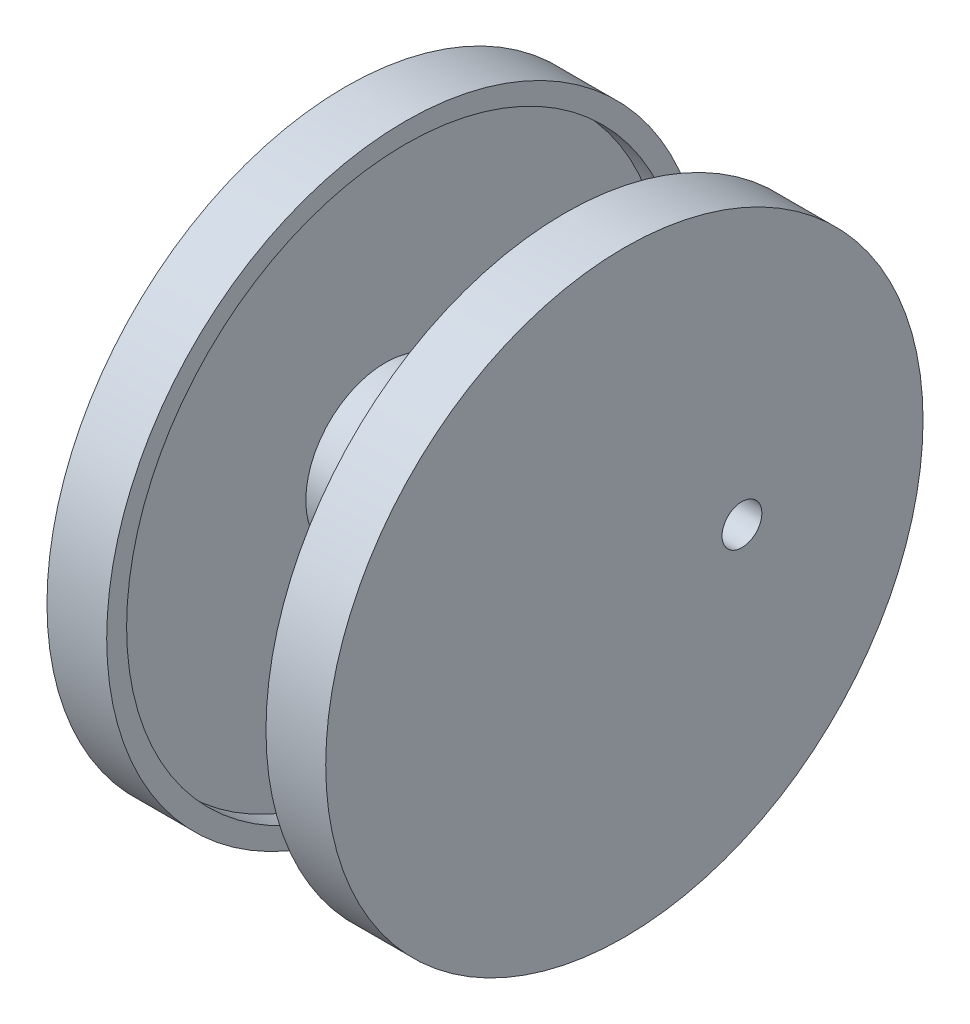
ISO-10303-21;
HEADER;
FILE_DESCRIPTION(('STEP AP214'),'2;1');
FILE_NAME('part.step','',(''),(''),'','','');
FILE_SCHEMA(('AUTOMOTIVE_DESIGN { 1 0 10303 214 1 1 1 1 }'));
ENDSEC;
DATA;
#1=APPLICATION_CONTEXT('core data for automotive mechanical design processes');
#2=APPLICATION_PROTOCOL_DEFINITION('international standard','automotive_design',2000,#1);
#3=PRODUCT_CONTEXT('',#1,'mechanical');
#4=PRODUCT('Part','Part','',(#3));
#5=PRODUCT_RELATED_PRODUCT_CATEGORY('part','',(#4));
#6=PRODUCT_DEFINITION_FORMATION('','',#4);
#7=PRODUCT_DEFINITION_CONTEXT('part definition',#1,'design');
#8=PRODUCT_DEFINITION('design','',#6,#7);
#9=PRODUCT_DEFINITION_SHAPE('','',#8);
#10=(LENGTH_UNIT() NAMED_UNIT(*) SI_UNIT(.MILLI.,.METRE.));
#11=(NAMED_UNIT(*) PLANE_ANGLE_UNIT() SI_UNIT($,.RADIAN.));
#12=(NAMED_UNIT(*) SI_UNIT($,.STERADIAN.) SOLID_ANGLE_UNIT());
#13=UNCERTAINTY_MEASURE_WITH_UNIT(LENGTH_MEASURE(1.E-05),#10,'distance_accuracy_value','');
#14=(GEOMETRIC_REPRESENTATION_CONTEXT(3) GLOBAL_UNCERTAINTY_ASSIGNED_CONTEXT((#13)) GLOBAL_UNIT_ASSIGNED_CONTEXT((#10,
#11,#12)) REPRESENTATION_CONTEXT('',''));
#15=CARTESIAN_POINT('',(0.,0.,0.));
#16=DIRECTION('',(0.,0.,1.));
#17=DIRECTION('',(1.,0.,0.));
#18=AXIS2_PLACEMENT_3D('',#15,#16,#17);
#19=CARTESIAN_POINT('',(-52.1153846153846,0.,0.));
#20=DIRECTION('',(1.,0.,0.));
#21=DIRECTION('',(0.,0.,-1.));
#22=AXIS2_PLACEMENT_3D('',#19,#20,#21);
#23=PLANE('',#22);
#24=DIRECTION('',(0.,-0.518631798459007,-0.854997694515708));
#25=VECTOR('',#24,1.);
#26=CARTESIAN_POINT('',(-52.1153846153846,40.0747288386996,62.2094535300279));
#27=LINE('',#26,#25);
#28=CARTESIAN_POINT('',(-52.1153846153846,40.0747288386996,62.2094535300279));
#29=VERTEX_POINT('',#28);
#30=CARTESIAN_POINT('',(-52.1153846153846,36.9617005075422,57.0774271984184));
#31=VERTEX_POINT('',#30);
#32=EDGE_CURVE('E212',#29,#31,#27,.T.);
#33=ORIENTED_EDGE('',*,*,#32,.F.);
#34=CARTESIAN_POINT('',(-52.1153846153846,0.,0.));
#35=DIRECTION('',(-1.,0.,0.));
#36=DIRECTION('',(0.,-0.95105651629515,0.309016994374958));
#37=AXIS2_PLACEMENT_3D('',#34,#35,#36);
#38=CIRCLE('',#37,74.);
#39=CARTESIAN_POINT('',(-52.1153846153846,4.14466266265028,73.8838397175785));
#40=VERTEX_POINT('',#39);
#41=EDGE_CURVE('E58',#40,#29,#38,.T.);
#42=ORIENTED_EDGE('',*,*,#41,.F.);
#43=DIRECTION('',(0.,0.0829730968038421,0.996551787518732));
#44=VECTOR('',#43,1.);
#45=CARTESIAN_POINT('',(-52.1153846153846,4.14466266265028,73.8838397175785));
#46=LINE('',#45,#44);
#47=CARTESIAN_POINT('',(-52.1153846153846,3.64662609443041,67.9021510567038));
#48=VERTEX_POINT('',#47);
#49=EDGE_CURVE('E200',#48,#40,#46,.T.);
#50=ORIENTED_EDGE('',*,*,#49,.F.);
#51=CARTESIAN_POINT('',(-52.1153846153846,0.,0.));
#52=DIRECTION('',(1.,0.,0.));
#53=DIRECTION('',(0.,-0.95105651629515,0.309016994374958));
#54=AXIS2_PLACEMENT_3D('',#51,#52,#53);
#55=CIRCLE('',#54,68.);
#56=EDGE_CURVE('E203',#31,#48,#55,.T.);
#57=ORIENTED_EDGE('',*,*,#56,.F.);
#58=EDGE_LOOP('',(#33,#42,#50,#57));
#59=FACE_BOUND('',#58,.T.);
#60=DIRECTION('',(0.,0.652885089239424,-0.757456969239065));
#61=VECTOR('',#60,1.);
#62=CARTESIAN_POINT('',(-52.1153846153846,-46.7809338987678,57.3371103523636));
#63=LINE('',#62,#61);
#64=CARTESIAN_POINT('',(-52.1153846153846,-46.7809338987678,57.3371103523636));
#65=VERTEX_POINT('',#64);
#66=CARTESIAN_POINT('',(-52.1153846153846,-42.8620654725905,52.790561120558));
#67=VERTEX_POINT('',#66);
#68=EDGE_CURVE('E236',#65,#67,#63,.T.);
#69=ORIENTED_EDGE('',*,*,#68,.F.);
#70=CARTESIAN_POINT('',(-52.1153846153846,0.,0.));
#71=DIRECTION('',(-1.,0.,0.));
#72=DIRECTION('',(0.,-0.58778525229248,-0.809016994374942));
#73=AXIS2_PLACEMENT_3D('',#70,#71,#72);
#74=CIRCLE('',#73,74.);
#75=CARTESIAN_POINT('',(-52.1153846153846,-68.9869360135996,26.7731705155651));
#76=VERTEX_POINT('',#75);
#77=EDGE_CURVE('E66',#76,#65,#74,.T.);
#78=ORIENTED_EDGE('',*,*,#77,.F.);
#79=DIRECTION('',(0.,-0.92213697435697,0.3868635425105));
#80=VECTOR('',#79,1.);
#81=CARTESIAN_POINT('',(-52.1153846153846,-68.9869360135996,26.7731705155651));
#82=LINE('',#81,#80);
#83=CARTESIAN_POINT('',(-52.1153846153846,-63.4519137976259,24.4510661407361));
#84=VERTEX_POINT('',#83);
#85=EDGE_CURVE('E225',#84,#76,#82,.T.);
#86=ORIENTED_EDGE('',*,*,#85,.F.);
#87=CARTESIAN_POINT('',(-52.1153846153846,0.,0.));
#88=DIRECTION('',(1.,0.,0.));
#89=DIRECTION('',(0.,-0.58778525229248,-0.809016994374942));
#90=AXIS2_PLACEMENT_3D('',#87,#88,#89);
#91=CIRCLE('',#90,68.);
#92=EDGE_CURVE('E239',#67,#84,#91,.T.);
#93=ORIENTED_EDGE('',*,*,#92,.F.);
#94=EDGE_LOOP('',(#69,#78,#86,#93));
#95=FACE_BOUND('',#94,.T.);
#96=DIRECTION('',(0.,0.922136974356975,0.386863542510487));
#97=VECTOR('',#96,1.);
#98=CARTESIAN_POINT('',(-52.1153846153846,-68.9869360136,-26.7731705155641));
#99=LINE('',#98,#97);
#100=CARTESIAN_POINT('',(-52.1153846153846,-68.9869360136,-26.7731705155641));
#101=VERTEX_POINT('',#100);
#102=CARTESIAN_POINT('',(-52.1153846153846,-63.4519137976263,-24.4510661407352));
#103=VERTEX_POINT('',#102);
#104=EDGE_CURVE('E267',#101,#103,#99,.T.);
#105=ORIENTED_EDGE('',*,*,#104,.F.);
#106=CARTESIAN_POINT('',(-52.1153846153846,0.,0.));
#107=DIRECTION('',(-1.,0.,0.));
#108=DIRECTION('',(0.,0.587785252292469,-0.809016994374951));
#109=AXIS2_PLACEMENT_3D('',#106,#107,#108);
#110=CIRCLE('',#109,74.);
#111=CARTESIAN_POINT('',(-52.1153846153846,-46.7809338987686,-57.3371103523629));
#112=VERTEX_POINT('',#111);
#113=EDGE_CURVE('E246',#112,#101,#110,.T.);
#114=ORIENTED_EDGE('',*,*,#113,.F.);
#115=DIRECTION('',(0.,-0.652885089239435,-0.757456969239055));
#116=VECTOR('',#115,1.);
#117=CARTESIAN_POINT('',(-52.1153846153846,-46.7809338987686,-57.3371103523629));
#118=LINE('',#117,#116);
#119=CARTESIAN_POINT('',(-52.1153846153846,-42.8620654725913,-52.7905611205573));
#120=VERTEX_POINT('',#119);
#121=EDGE_CURVE('E256',#120,#112,#118,.T.);
#122=ORIENTED_EDGE('',*,*,#121,.F.);
#123=CARTESIAN_POINT('',(-52.1153846153846,0.,0.));
#124=DIRECTION('',(1.,0.,0.));
#125=DIRECTION('',(0.,0.587785252292469,-0.809016994374951));
#126=AXIS2_PLACEMENT_3D('',#123,#124,#125);
#127=CIRCLE('',#126,68.);
#128=EDGE_CURVE('E270',#103,#120,#127,.T.);
#129=ORIENTED_EDGE('',*,*,#128,.F.);
#130=EDGE_LOOP('',(#105,#114,#122,#129));
#131=FACE_BOUND('',#130,.T.);
#132=DIRECTION('',(0.,-0.082973096803828,0.996551787518734));
#133=VECTOR('',#132,1.);
#134=CARTESIAN_POINT('',(-52.1153846153846,4.14466266264922,-73.8838397175786));
#135=LINE('',#134,#133);
#136=CARTESIAN_POINT('',(-52.1153846153846,4.14466266264922,-73.8838397175786));
#137=VERTEX_POINT('',#136);
#138=CARTESIAN_POINT('',(-52.1153846153846,3.64662609442944,-67.9021510567039));
#139=VERTEX_POINT('',#138);
#140=EDGE_CURVE('E299',#137,#139,#135,.T.);
#141=ORIENTED_EDGE('',*,*,#140,.F.);
#142=CARTESIAN_POINT('',(-52.1153846153846,0.,0.));
#143=DIRECTION('',(-1.,0.,0.));
#144=DIRECTION('',(0.,0.951056516295155,0.309016994374945));
#145=AXIS2_PLACEMENT_3D('',#142,#143,#144);
#146=CIRCLE('',#145,74.);
#147=CARTESIAN_POINT('',(-52.1153846153846,40.0747288386987,-62.2094535300285));
#148=VERTEX_POINT('',#147);
#149=EDGE_CURVE('E277',#148,#137,#146,.T.);
#150=ORIENTED_EDGE('',*,*,#149,.F.);
#151=DIRECTION('',(0.,0.518631798458994,-0.854997694515716));
#152=VECTOR('',#151,1.);
#153=CARTESIAN_POINT('',(-52.1153846153846,40.0747288386987,-62.2094535300285));
#154=LINE('',#153,#152);
#155=CARTESIAN_POINT('',(-52.1153846153846,36.9617005075414,-57.077427198419));
#156=VERTEX_POINT('',#155);
#157=EDGE_CURVE('E288',#156,#148,#154,.T.);
#158=ORIENTED_EDGE('',*,*,#157,.F.);
#159=CARTESIAN_POINT('',(-52.1153846153846,0.,0.));
#160=DIRECTION('',(1.,0.,0.));
#161=DIRECTION('',(0.,0.951056516295155,0.309016994374945));
#162=AXIS2_PLACEMENT_3D('',#159,#160,#161);
#163=CIRCLE('',#162,68.);
#164=EDGE_CURVE('E302',#139,#156,#163,.T.);
#165=ORIENTED_EDGE('',*,*,#164,.F.);
#166=EDGE_LOOP('',(#141,#150,#158,#165));
#167=FACE_BOUND('',#166,.T.);
#168=DIRECTION('',(0.,-0.973417168333576,0.229039333725548));
#169=VECTOR('',#168,1.);
#170=CARTESIAN_POINT('',(-52.1153846153846,71.5484784110198,-18.8895536492485));
#171=LINE('',#170,#169);
#172=CARTESIAN_POINT('',(-52.1153846153846,71.5484784110198,-18.8895536492485));
#173=VERTEX_POINT('',#172);
#174=CARTESIAN_POINT('',(-52.1153846153846,65.7056526682459,-17.514771121537));
#175=VERTEX_POINT('',#174);
#176=EDGE_CURVE('E331',#173,#175,#171,.T.);
#177=ORIENTED_EDGE('',*,*,#176,.F.);
#178=CARTESIAN_POINT('',(-52.1153846153846,0.,0.));
#179=DIRECTION('',(-1.,0.,0.));
#180=DIRECTION('',(0.,0.,1.));
#181=AXIS2_PLACEMENT_3D('',#178,#179,#180);
#182=CIRCLE('',#181,74.);
#183=CARTESIAN_POINT('',(-52.1153846153846,71.5484784110198,18.8895536492485));
#184=VERTEX_POINT('',#183);
#185=EDGE_CURVE('E309',#184,#173,#182,.T.);
#186=ORIENTED_EDGE('',*,*,#185,.F.);
#187=DIRECTION('',(0.,0.973417168333576,0.229039333725548));
#188=VECTOR('',#187,1.);
#189=CARTESIAN_POINT('',(-52.1153846153846,71.5484784110198,18.8895536492485));
#190=LINE('',#189,#188);
#191=CARTESIAN_POINT('',(-52.1153846153846,65.7056526682459,17.514771121537));
#192=VERTEX_POINT('',#191);
#193=EDGE_CURVE('E320',#192,#184,#190,.T.);
#194=ORIENTED_EDGE('',*,*,#193,.F.);
#195=CARTESIAN_POINT('',(-52.1153846153846,0.,0.));
#196=DIRECTION('',(1.,0.,0.));
#197=DIRECTION('',(0.,0.,1.));
#198=AXIS2_PLACEMENT_3D('',#195,#196,#197);
#199=CIRCLE('',#198,68.);
#200=EDGE_CURVE('E334',#175,#192,#199,.T.);
#201=ORIENTED_EDGE('',*,*,#200,.F.);
#202=EDGE_LOOP('',(#177,#186,#194,#201));
#203=FACE_BOUND('',#202,.T.);
#204=CARTESIAN_POINT('',(-52.1153846153846,0.,0.));
#205=DIRECTION('',(-1.,0.,0.));
#206=DIRECTION('',(0.,0.,1.));
#207=AXIS2_PLACEMENT_3D('',#204,#205,#206);
#208=CIRCLE('',#207,75.);
#209=CARTESIAN_POINT('',(-52.1153846153846,0.,75.));
#210=VERTEX_POINT('',#209);
#211=EDGE_CURVE('E13',#210,#210,#208,.T.);
#212=ORIENTED_EDGE('',*,*,#211,.T.);
#213=EDGE_LOOP('',(#212));
#214=FACE_BOUND('',#213,.T.);
#215=ADVANCED_FACE('F44',(#59,#95,#131,#167,#203,#214),#23,.F.);
#216=CARTESIAN_POINT('',(-114.196582099836,0.,0.));
#217=DIRECTION('',(-1.,0.,0.));
#218=DIRECTION('',(0.,0.,1.));
#219=AXIS2_PLACEMENT_3D('',#216,#217,#218);
#220=CYLINDRICAL_SURFACE('',#219,75.);
#221=ORIENTED_EDGE('',*,*,#211,.F.);
#222=EDGE_LOOP('',(#221));
#223=FACE_BOUND('',#222,.T.);
#224=CARTESIAN_POINT('',(-37.1153846153846,0.,0.));
#225=DIRECTION('',(-1.,0.,0.));
#226=DIRECTION('',(0.,0.,1.));
#227=AXIS2_PLACEMENT_3D('',#224,#225,#226);
#228=CIRCLE('',#227,75.);
#229=CARTESIAN_POINT('',(-37.1153846153846,0.,75.));
#230=VERTEX_POINT('',#229);
#231=EDGE_CURVE('E51',#230,#230,#228,.T.);
#232=ORIENTED_EDGE('',*,*,#231,.T.);
#233=EDGE_LOOP('',(#232));
#234=FACE_BOUND('',#233,.T.);
#235=ADVANCED_FACE('F373',(#223,#234),#220,.T.);
#236=CARTESIAN_POINT('',(-37.1153846153846,75.,0.));
#237=DIRECTION('',(-1.,0.,0.));
#238=DIRECTION('',(0.,0.,1.));
#239=AXIS2_PLACEMENT_3D('',#236,#237,#238);
#240=PLANE('',#239);
#241=ORIENTED_EDGE('',*,*,#231,.F.);
#242=EDGE_LOOP('',(#241));
#243=FACE_BOUND('',#242,.T.);
#244=CARTESIAN_POINT('',(-37.1153846153846,0.,0.));
#245=DIRECTION('',(-1.,0.,0.));
#246=DIRECTION('',(0.,0.,1.));
#247=AXIS2_PLACEMENT_3D('',#244,#245,#246);
#248=CIRCLE('',#247,70.);
#249=CARTESIAN_POINT('',(-37.1153846153846,0.,70.));
#250=VERTEX_POINT('',#249);
#251=EDGE_CURVE('E368',#250,#250,#248,.T.);
#252=ORIENTED_EDGE('',*,*,#251,.T.);
#253=EDGE_LOOP('',(#252));
#254=FACE_BOUND('',#253,.T.);
#255=ADVANCED_FACE('F375',(#243,#254),#240,.F.);
#256=CARTESIAN_POINT('',(-114.196582099836,0.,0.));
#257=DIRECTION('',(-1.,0.,0.));
#258=DIRECTION('',(0.,0.,1.));
#259=AXIS2_PLACEMENT_3D('',#256,#257,#258);
#260=CYLINDRICAL_SURFACE('',#259,70.);
#261=ORIENTED_EDGE('',*,*,#251,.F.);
#262=EDGE_LOOP('',(#261));
#263=FACE_BOUND('',#262,.T.);
#264=CARTESIAN_POINT('',(-42.1153846153846,0.,0.));
#265=DIRECTION('',(-1.,0.,0.));
#266=DIRECTION('',(0.,0.,1.));
#267=AXIS2_PLACEMENT_3D('',#264,#265,#266);
#268=CIRCLE('',#267,70.);
#269=CARTESIAN_POINT('',(-42.1153846153846,0.,70.));
#270=VERTEX_POINT('',#269);
#271=EDGE_CURVE('E365',#270,#270,#268,.T.);
#272=ORIENTED_EDGE('',*,*,#271,.T.);
#273=EDGE_LOOP('',(#272));
#274=FACE_BOUND('',#273,.T.);
#275=ADVANCED_FACE('F378',(#263,#274),#260,.F.);
#276=CARTESIAN_POINT('',(-42.1153846153846,70.,0.));
#277=DIRECTION('',(-1.,0.,0.));
#278=DIRECTION('',(0.,0.,1.));
#279=AXIS2_PLACEMENT_3D('',#276,#277,#278);
#280=PLANE('',#279);
#281=ORIENTED_EDGE('',*,*,#271,.F.);
#282=EDGE_LOOP('',(#281));
#283=FACE_BOUND('',#282,.T.);
#284=CARTESIAN_POINT('',(-42.1153846153846,0.,0.));
#285=DIRECTION('',(-1.,0.,0.));
#286=DIRECTION('',(0.,0.,1.));
#287=AXIS2_PLACEMENT_3D('',#284,#285,#286);
#288=CIRCLE('',#287,20.);
#289=CARTESIAN_POINT('',(-42.1153846153846,0.,20.));
#290=VERTEX_POINT('',#289);
#291=EDGE_CURVE('E362',#290,#290,#288,.T.);
#292=ORIENTED_EDGE('',*,*,#291,.T.);
#293=EDGE_LOOP('',(#292));
#294=FACE_BOUND('',#293,.T.);
#295=ADVANCED_FACE('F384',(#283,#294),#280,.F.);
#296=CARTESIAN_POINT('',(-114.196582099836,0.,0.));
#297=DIRECTION('',(-1.,0.,0.));
#298=DIRECTION('',(0.,0.,1.));
#299=AXIS2_PLACEMENT_3D('',#296,#297,#298);
#300=CYLINDRICAL_SURFACE('',#299,20.);
#301=ORIENTED_EDGE('',*,*,#291,.F.);
#302=EDGE_LOOP('',(#301));
#303=FACE_BOUND('',#302,.T.);
#304=CARTESIAN_POINT('',(7.88461538461539,0.,0.));
#305=DIRECTION('',(-1.,0.,0.));
#306=DIRECTION('',(0.,0.,1.));
#307=AXIS2_PLACEMENT_3D('',#304,#305,#306);
#308=CIRCLE('',#307,20.);
#309=CARTESIAN_POINT('',(7.88461538461539,0.,20.));
#310=VERTEX_POINT('',#309);
#311=EDGE_CURVE('E359',#310,#310,#308,.T.);
#312=ORIENTED_EDGE('',*,*,#311,.T.);
#313=EDGE_LOOP('',(#312));
#314=FACE_BOUND('',#313,.T.);
#315=ADVANCED_FACE('F390',(#303,#314),#300,.T.);
#316=CARTESIAN_POINT('',(7.88461538461539,20.,0.));
#317=DIRECTION('',(1.,0.,0.));
#318=DIRECTION('',(0.,0.,-1.));
#319=AXIS2_PLACEMENT_3D('',#316,#317,#318);
#320=PLANE('',#319);
#321=CARTESIAN_POINT('',(7.88461538461539,0.,-29.5197008608615));
#322=DIRECTION('',(1.,0.,0.));
#323=DIRECTION('',(0.,0.,-1.));
#324=AXIS2_PLACEMENT_3D('',#321,#322,#323);
#325=CIRCLE('',#324,5.);
#326=CARTESIAN_POINT('',(7.88461538461539,0.,-34.5197008608615));
#327=VERTEX_POINT('',#326);
#328=EDGE_CURVE('E206',#327,#327,#325,.T.);
#329=ORIENTED_EDGE('',*,*,#328,.T.);
#330=EDGE_LOOP('',(#329));
#331=FACE_BOUND('',#330,.T.);
#332=ORIENTED_EDGE('',*,*,#311,.F.);
#333=EDGE_LOOP('',(#332));
#334=FACE_BOUND('',#333,.T.);
#335=CARTESIAN_POINT('',(7.88461538461539,0.,0.));
#336=DIRECTION('',(-1.,0.,0.));
#337=DIRECTION('',(0.,0.,1.));
#338=AXIS2_PLACEMENT_3D('',#335,#336,#337);
#339=CIRCLE('',#338,70.);
#340=CARTESIAN_POINT('',(7.88461538461539,0.,70.));
#341=VERTEX_POINT('',#340);
#342=EDGE_CURVE('E356',#341,#341,#339,.T.);
#343=ORIENTED_EDGE('',*,*,#342,.T.);
#344=EDGE_LOOP('',(#343));
#345=FACE_BOUND('',#344,.T.);
#346=ADVANCED_FACE('F396',(#331,#334,#345),#320,.F.);
#347=CARTESIAN_POINT('',(-114.196582099836,0.,0.));
#348=DIRECTION('',(-1.,0.,0.));
#349=DIRECTION('',(0.,0.,1.));
#350=AXIS2_PLACEMENT_3D('',#347,#348,#349);
#351=CYLINDRICAL_SURFACE('',#350,70.);
#352=ORIENTED_EDGE('',*,*,#342,.F.);
#353=EDGE_LOOP('',(#352));
#354=FACE_BOUND('',#353,.T.);
#355=CARTESIAN_POINT('',(2.88461538461539,0.,0.));
#356=DIRECTION('',(-1.,0.,0.));
#357=DIRECTION('',(0.,0.,1.));
#358=AXIS2_PLACEMENT_3D('',#355,#356,#357);
#359=CIRCLE('',#358,70.);
#360=CARTESIAN_POINT('',(2.88461538461539,0.,70.));
#361=VERTEX_POINT('',#360);
#362=EDGE_CURVE('E353',#361,#361,#359,.T.);
#363=ORIENTED_EDGE('',*,*,#362,.T.);
#364=EDGE_LOOP('',(#363));
#365=FACE_BOUND('',#364,.T.);
#366=ADVANCED_FACE('F402',(#354,#365),#351,.F.);
#367=CARTESIAN_POINT('',(2.88461538461539,70.,0.));
#368=DIRECTION('',(1.,0.,0.));
#369=DIRECTION('',(0.,0.,-1.));
#370=AXIS2_PLACEMENT_3D('',#367,#368,#369);
#371=PLANE('',#370);
#372=ORIENTED_EDGE('',*,*,#362,.F.);
#373=EDGE_LOOP('',(#372));
#374=FACE_BOUND('',#373,.T.);
#375=CARTESIAN_POINT('',(2.88461538461539,0.,0.));
#376=DIRECTION('',(-1.,0.,0.));
#377=DIRECTION('',(0.,0.,1.));
#378=AXIS2_PLACEMENT_3D('',#375,#376,#377);
#379=CIRCLE('',#378,75.);
#380=CARTESIAN_POINT('',(2.88461538461539,0.,75.));
#381=VERTEX_POINT('',#380);
#382=EDGE_CURVE('E350',#381,#381,#379,.T.);
#383=ORIENTED_EDGE('',*,*,#382,.T.);
#384=EDGE_LOOP('',(#383));
#385=FACE_BOUND('',#384,.T.);
#386=ADVANCED_FACE('F409',(#374,#385),#371,.F.);
#387=CARTESIAN_POINT('',(-114.196582099836,0.,0.));
#388=DIRECTION('',(-1.,0.,0.));
#389=DIRECTION('',(0.,0.,1.));
#390=AXIS2_PLACEMENT_3D('',#387,#388,#389);
#391=CYLINDRICAL_SURFACE('',#390,75.);
#392=ORIENTED_EDGE('',*,*,#382,.F.);
#393=EDGE_LOOP('',(#392));
#394=FACE_BOUND('',#393,.T.);
#395=CARTESIAN_POINT('',(17.8846153846154,0.,0.));
#396=DIRECTION('',(-1.,0.,0.));
#397=DIRECTION('',(0.,0.,1.));
#398=AXIS2_PLACEMENT_3D('',#395,#396,#397);
#399=CIRCLE('',#398,75.);
#400=CARTESIAN_POINT('',(17.8846153846154,0.,75.));
#401=VERTEX_POINT('',#400);
#402=EDGE_CURVE('E341',#401,#401,#399,.T.);
#403=ORIENTED_EDGE('',*,*,#402,.T.);
#404=EDGE_LOOP('',(#403));
#405=FACE_BOUND('',#404,.T.);
#406=ADVANCED_FACE('F415',(#394,#405),#391,.T.);
#407=CARTESIAN_POINT('',(17.8846153846154,75.,0.));
#408=DIRECTION('',(-1.,0.,0.));
#409=DIRECTION('',(0.,0.,1.));
#410=AXIS2_PLACEMENT_3D('',#407,#408,#409);
#411=PLANE('',#410);
#412=CARTESIAN_POINT('',(17.8846153846154,0.,-29.5197008608615));
#413=DIRECTION('',(1.,0.,0.));
#414=DIRECTION('',(0.,0.,-1.));
#415=AXIS2_PLACEMENT_3D('',#412,#413,#414);
#416=CIRCLE('',#415,5.);
#417=CARTESIAN_POINT('',(17.8846153846154,0.,-34.5197008608615));
#418=VERTEX_POINT('',#417);
#419=EDGE_CURVE('E657',#418,#418,#416,.T.);
#420=ORIENTED_EDGE('',*,*,#419,.F.);
#421=EDGE_LOOP('',(#420));
#422=FACE_BOUND('',#421,.T.);
#423=ORIENTED_EDGE('',*,*,#402,.F.);
#424=EDGE_LOOP('',(#423));
#425=FACE_BOUND('',#424,.T.);
#426=ADVANCED_FACE('F421',(#422,#425),#411,.F.);
#427=CARTESIAN_POINT('',(-47.1153846153846,0.,0.));
#428=DIRECTION('',(-1.,0.,0.));
#429=DIRECTION('',(0.,0.,1.));
#430=AXIS2_PLACEMENT_3D('',#427,#428,#429);
#431=CYLINDRICAL_SURFACE('',#430,74.);
#432=ORIENTED_EDGE('',*,*,#185,.T.);
#433=DIRECTION('',(-1.,0.,0.));
#434=VECTOR('',#433,1.);
#435=CARTESIAN_POINT('',(-47.1153846153846,71.5484784110198,-18.8895536492485));
#436=LINE('',#435,#434);
#437=CARTESIAN_POINT('',(-47.1153846153846,71.5484784110198,-18.8895536492485));
#438=VERTEX_POINT('',#437);
#439=EDGE_CURVE('E329',#438,#173,#436,.T.);
#440=ORIENTED_EDGE('',*,*,#439,.F.);
#441=CARTESIAN_POINT('',(-47.1153846153846,0.,0.));
#442=DIRECTION('',(-1.,0.,0.));
#443=DIRECTION('',(0.,0.,1.));
#444=AXIS2_PLACEMENT_3D('',#441,#442,#443);
#445=CIRCLE('',#444,74.);
#446=CARTESIAN_POINT('',(-47.1153846153846,71.5484784110198,18.8895536492485));
#447=VERTEX_POINT('',#446);
#448=EDGE_CURVE('E316',#447,#438,#445,.T.);
#449=ORIENTED_EDGE('',*,*,#448,.F.);
#450=DIRECTION('',(-1.,0.,0.));
#451=VECTOR('',#450,1.);
#452=CARTESIAN_POINT('',(-47.1153846153846,71.5484784110198,18.8895536492485));
#453=LINE('',#452,#451);
#454=EDGE_CURVE('E339',#447,#184,#453,.T.);
#455=ORIENTED_EDGE('',*,*,#454,.T.);
#456=EDGE_LOOP('',(#432,#440,#449,#455));
#457=FACE_BOUND('',#456,.T.);
#458=ADVANCED_FACE('F426',(#457),#431,.F.);
#459=CARTESIAN_POINT('',(-47.1153846153846,71.5484784110198,18.8895536492485));
#460=DIRECTION('',(0.,-0.229039333725548,0.973417168333576));
#461=DIRECTION('',(0.,-0.973417168333576,-0.229039333725548));
#462=AXIS2_PLACEMENT_3D('',#459,#460,#461);
#463=PLANE('',#462);
#464=ORIENTED_EDGE('',*,*,#193,.T.);
#465=ORIENTED_EDGE('',*,*,#454,.F.);
#466=DIRECTION('',(0.,0.973417168333576,0.229039333725548));
#467=VECTOR('',#466,1.);
#468=CARTESIAN_POINT('',(-47.1153846153846,71.5484784110198,18.8895536492485));
#469=LINE('',#468,#467);
#470=CARTESIAN_POINT('',(-47.1153846153846,65.7056526682459,17.514771121537));
#471=VERTEX_POINT('',#470);
#472=EDGE_CURVE('E326',#471,#447,#469,.T.);
#473=ORIENTED_EDGE('',*,*,#472,.F.);
#474=DIRECTION('',(-1.,0.,0.));
#475=VECTOR('',#474,1.);
#476=CARTESIAN_POINT('',(-47.1153846153846,65.7056526682459,17.514771121537));
#477=LINE('',#476,#475);
#478=EDGE_CURVE('E342',#471,#192,#477,.T.);
#479=ORIENTED_EDGE('',*,*,#478,.T.);
#480=EDGE_LOOP('',(#464,#465,#473,#479));
#481=FACE_BOUND('',#480,.T.);
#482=ADVANCED_FACE('F432',(#481),#463,.F.);
#483=CARTESIAN_POINT('',(-47.1153846153846,0.,0.));
#484=DIRECTION('',(-1.,0.,0.));
#485=DIRECTION('',(0.,0.,1.));
#486=AXIS2_PLACEMENT_3D('',#483,#484,#485);
#487=CYLINDRICAL_SURFACE('',#486,68.);
#488=ORIENTED_EDGE('',*,*,#200,.T.);
#489=ORIENTED_EDGE('',*,*,#478,.F.);
#490=CARTESIAN_POINT('',(-47.1153846153846,0.,0.));
#491=DIRECTION('',(1.,0.,0.));
#492=DIRECTION('',(0.,0.,1.));
#493=AXIS2_PLACEMENT_3D('',#490,#491,#492);
#494=CIRCLE('',#493,68.);
#495=CARTESIAN_POINT('',(-47.1153846153846,65.7056526682459,-17.514771121537));
#496=VERTEX_POINT('',#495);
#497=EDGE_CURVE('E323',#496,#471,#494,.T.);
#498=ORIENTED_EDGE('',*,*,#497,.F.);
#499=DIRECTION('',(-1.,0.,0.));
#500=VECTOR('',#499,1.);
#501=CARTESIAN_POINT('',(-47.1153846153846,65.7056526682459,-17.514771121537));
#502=LINE('',#501,#500);
#503=EDGE_CURVE('E344',#496,#175,#502,.T.);
#504=ORIENTED_EDGE('',*,*,#503,.T.);
#505=EDGE_LOOP('',(#488,#489,#498,#504));
#506=FACE_BOUND('',#505,.T.);
#507=ADVANCED_FACE('F469',(#506),#487,.T.);
#508=CARTESIAN_POINT('',(-47.1153846153846,71.5484784110198,-18.8895536492485));
#509=DIRECTION('',(0.,-0.229039333725548,-0.973417168333576));
#510=DIRECTION('',(0.,0.973417168333576,-0.229039333725548));
#511=AXIS2_PLACEMENT_3D('',#508,#509,#510);
#512=PLANE('',#511);
#513=ORIENTED_EDGE('',*,*,#176,.T.);
#514=ORIENTED_EDGE('',*,*,#503,.F.);
#515=DIRECTION('',(0.,-0.973417168333576,0.229039333725548));
#516=VECTOR('',#515,1.);
#517=CARTESIAN_POINT('',(-47.1153846153846,71.5484784110198,-18.8895536492485));
#518=LINE('',#517,#516);
#519=EDGE_CURVE('E319',#438,#496,#518,.T.);
#520=ORIENTED_EDGE('',*,*,#519,.F.);
#521=ORIENTED_EDGE('',*,*,#439,.T.);
#522=EDGE_LOOP('',(#513,#514,#520,#521));
#523=FACE_BOUND('',#522,.T.);
#524=ADVANCED_FACE('F462',(#523),#512,.F.);
#525=CARTESIAN_POINT('',(-47.1153846153846,0.,0.));
#526=DIRECTION('',(-1.,0.,0.));
#527=DIRECTION('',(0.,0.,1.));
#528=AXIS2_PLACEMENT_3D('',#525,#526,#527);
#529=PLANE('',#528);
#530=ORIENTED_EDGE('',*,*,#448,.T.);
#531=ORIENTED_EDGE('',*,*,#519,.T.);
#532=ORIENTED_EDGE('',*,*,#497,.T.);
#533=ORIENTED_EDGE('',*,*,#472,.T.);
#534=EDGE_LOOP('',(#530,#531,#532,#533));
#535=FACE_BOUND('',#534,.T.);
#536=ADVANCED_FACE('F471',(#535),#529,.T.);
#537=CARTESIAN_POINT('',(-47.1153846153846,0.,0.));
#538=DIRECTION('',(-1.,0.,0.));
#539=DIRECTION('',(0.,0.,1.));
#540=AXIS2_PLACEMENT_3D('',#537,#538,#539);
#541=CYLINDRICAL_SURFACE('',#540,74.);
#542=ORIENTED_EDGE('',*,*,#149,.T.);
#543=DIRECTION('',(-1.,0.,0.));
#544=VECTOR('',#543,1.);
#545=CARTESIAN_POINT('',(-47.1153846153846,4.14466266264922,-73.8838397175786));
#546=LINE('',#545,#544);
#547=CARTESIAN_POINT('',(-47.1153846153846,4.14466266264922,-73.8838397175786));
#548=VERTEX_POINT('',#547);
#549=EDGE_CURVE('E297',#548,#137,#546,.T.);
#550=ORIENTED_EDGE('',*,*,#549,.F.);
#551=CARTESIAN_POINT('',(-47.1153846153846,0.,0.));
#552=DIRECTION('',(-1.,0.,0.));
#553=DIRECTION('',(0.,0.951056516295155,0.309016994374945));
#554=AXIS2_PLACEMENT_3D('',#551,#552,#553);
#555=CIRCLE('',#554,74.);
#556=CARTESIAN_POINT('',(-47.1153846153846,40.0747288386987,-62.2094535300285));
#557=VERTEX_POINT('',#556);
#558=EDGE_CURVE('E284',#557,#548,#555,.T.);
#559=ORIENTED_EDGE('',*,*,#558,.F.);
#560=DIRECTION('',(-1.,0.,0.));
#561=VECTOR('',#560,1.);
#562=CARTESIAN_POINT('',(-47.1153846153846,40.0747288386987,-62.2094535300285));
#563=LINE('',#562,#561);
#564=EDGE_CURVE('E307',#557,#148,#563,.T.);
#565=ORIENTED_EDGE('',*,*,#564,.T.);
#566=EDGE_LOOP('',(#542,#550,#559,#565));
#567=FACE_BOUND('',#566,.T.);
#568=ADVANCED_FACE('F473',(#567),#541,.F.);
#569=CARTESIAN_POINT('',(-47.1153846153846,40.0747288386987,-62.2094535300285));
#570=DIRECTION('',(0.,0.854997694515716,0.518631798458994));
#571=DIRECTION('',(0.,-0.518631798458994,0.854997694515716));
#572=AXIS2_PLACEMENT_3D('',#569,#570,#571);
#573=PLANE('',#572);
#574=ORIENTED_EDGE('',*,*,#157,.T.);
#575=ORIENTED_EDGE('',*,*,#564,.F.);
#576=DIRECTION('',(0.,0.518631798458994,-0.854997694515716));
#577=VECTOR('',#576,1.);
#578=CARTESIAN_POINT('',(-47.1153846153846,40.0747288386987,-62.2094535300285));
#579=LINE('',#578,#577);
#580=CARTESIAN_POINT('',(-47.1153846153846,36.9617005075414,-57.077427198419));
#581=VERTEX_POINT('',#580);
#582=EDGE_CURVE('E294',#581,#557,#579,.T.);
#583=ORIENTED_EDGE('',*,*,#582,.F.);
#584=DIRECTION('',(-1.,0.,0.));
#585=VECTOR('',#584,1.);
#586=CARTESIAN_POINT('',(-47.1153846153846,36.9617005075414,-57.077427198419));
#587=LINE('',#586,#585);
#588=EDGE_CURVE('E310',#581,#156,#587,.T.);
#589=ORIENTED_EDGE('',*,*,#588,.T.);
#590=EDGE_LOOP('',(#574,#575,#583,#589));
#591=FACE_BOUND('',#590,.T.);
#592=ADVANCED_FACE('F479',(#591),#573,.F.);
#593=CARTESIAN_POINT('',(-47.1153846153846,0.,0.));
#594=DIRECTION('',(-1.,0.,0.));
#595=DIRECTION('',(0.,0.,1.));
#596=AXIS2_PLACEMENT_3D('',#593,#594,#595);
#597=CYLINDRICAL_SURFACE('',#596,68.);
#598=ORIENTED_EDGE('',*,*,#164,.T.);
#599=ORIENTED_EDGE('',*,*,#588,.F.);
#600=CARTESIAN_POINT('',(-47.1153846153846,0.,0.));
#601=DIRECTION('',(1.,0.,0.));
#602=DIRECTION('',(0.,0.951056516295155,0.309016994374945));
#603=AXIS2_PLACEMENT_3D('',#600,#601,#602);
#604=CIRCLE('',#603,68.);
#605=CARTESIAN_POINT('',(-47.1153846153846,3.64662609442944,-67.9021510567039));
#606=VERTEX_POINT('',#605);
#607=EDGE_CURVE('E291',#606,#581,#604,.T.);
#608=ORIENTED_EDGE('',*,*,#607,.F.);
#609=DIRECTION('',(-1.,0.,0.));
#610=VECTOR('',#609,1.);
#611=CARTESIAN_POINT('',(-47.1153846153846,3.64662609442944,-67.9021510567039));
#612=LINE('',#611,#610);
#613=EDGE_CURVE('E312',#606,#139,#612,.T.);
#614=ORIENTED_EDGE('',*,*,#613,.T.);
#615=EDGE_LOOP('',(#598,#599,#608,#614));
#616=FACE_BOUND('',#615,.T.);
#617=ADVANCED_FACE('F509',(#616),#597,.T.);
#618=CARTESIAN_POINT('',(-47.1153846153846,4.14466266264922,-73.8838397175786));
#619=DIRECTION('',(0.,-0.996551787518733,-0.082973096803828));
#620=DIRECTION('',(0.,0.082973096803828,-0.996551787518733));
#621=AXIS2_PLACEMENT_3D('',#618,#619,#620);
#622=PLANE('',#621);
#623=ORIENTED_EDGE('',*,*,#140,.T.);
#624=ORIENTED_EDGE('',*,*,#613,.F.);
#625=DIRECTION('',(0.,-0.082973096803828,0.996551787518734));
#626=VECTOR('',#625,1.);
#627=CARTESIAN_POINT('',(-47.1153846153846,4.14466266264922,-73.8838397175786));
#628=LINE('',#627,#626);
#629=EDGE_CURVE('E287',#548,#606,#628,.T.);
#630=ORIENTED_EDGE('',*,*,#629,.F.);
#631=ORIENTED_EDGE('',*,*,#549,.T.);
#632=EDGE_LOOP('',(#623,#624,#630,#631));
#633=FACE_BOUND('',#632,.T.);
#634=ADVANCED_FACE('F517',(#633),#622,.F.);
#635=CARTESIAN_POINT('',(-47.1153846153846,0.,0.));
#636=DIRECTION('',(-1.,0.,0.));
#637=DIRECTION('',(0.,0.951056516295155,0.309016994374945));
#638=AXIS2_PLACEMENT_3D('',#635,#636,#637);
#639=PLANE('',#638);
#640=ORIENTED_EDGE('',*,*,#558,.T.);
#641=ORIENTED_EDGE('',*,*,#629,.T.);
#642=ORIENTED_EDGE('',*,*,#607,.T.);
#643=ORIENTED_EDGE('',*,*,#582,.T.);
#644=EDGE_LOOP('',(#640,#641,#642,#643));
#645=FACE_BOUND('',#644,.T.);
#646=ADVANCED_FACE('F525',(#645),#639,.T.);
#647=CARTESIAN_POINT('',(-47.1153846153846,0.,0.));
#648=DIRECTION('',(-1.,0.,0.));
#649=DIRECTION('',(0.,0.,1.));
#650=AXIS2_PLACEMENT_3D('',#647,#648,#649);
#651=CYLINDRICAL_SURFACE('',#650,74.);
#652=ORIENTED_EDGE('',*,*,#113,.T.);
#653=DIRECTION('',(-1.,0.,0.));
#654=VECTOR('',#653,1.);
#655=CARTESIAN_POINT('',(-47.1153846153846,-68.9869360136,-26.7731705155641));
#656=LINE('',#655,#654);
#657=CARTESIAN_POINT('',(-47.1153846153846,-68.9869360136,-26.7731705155641));
#658=VERTEX_POINT('',#657);
#659=EDGE_CURVE('E265',#658,#101,#656,.T.);
#660=ORIENTED_EDGE('',*,*,#659,.F.);
#661=CARTESIAN_POINT('',(-47.1153846153846,0.,0.));
#662=DIRECTION('',(-1.,0.,0.));
#663=DIRECTION('',(0.,0.587785252292469,-0.809016994374951));
#664=AXIS2_PLACEMENT_3D('',#661,#662,#663);
#665=CIRCLE('',#664,74.);
#666=CARTESIAN_POINT('',(-47.1153846153846,-46.7809338987686,-57.3371103523629));
#667=VERTEX_POINT('',#666);
#668=EDGE_CURVE('E252',#667,#658,#665,.T.);
#669=ORIENTED_EDGE('',*,*,#668,.F.);
#670=DIRECTION('',(-1.,0.,0.));
#671=VECTOR('',#670,1.);
#672=CARTESIAN_POINT('',(-47.1153846153846,-46.7809338987686,-57.3371103523629));
#673=LINE('',#672,#671);
#674=EDGE_CURVE('E275',#667,#112,#673,.T.);
#675=ORIENTED_EDGE('',*,*,#674,.T.);
#676=EDGE_LOOP('',(#652,#660,#669,#675));
#677=FACE_BOUND('',#676,.T.);
#678=ADVANCED_FACE('F532',(#677),#651,.F.);
#679=CARTESIAN_POINT('',(-47.1153846153846,-46.7809338987686,-57.3371103523629));
#680=DIRECTION('',(0.,0.757456969239055,-0.652885089239435));
#681=DIRECTION('',(0.,0.652885089239435,0.757456969239055));
#682=AXIS2_PLACEMENT_3D('',#679,#680,#681);
#683=PLANE('',#682);
#684=ORIENTED_EDGE('',*,*,#121,.T.);
#685=ORIENTED_EDGE('',*,*,#674,.F.);
#686=DIRECTION('',(0.,-0.652885089239435,-0.757456969239055));
#687=VECTOR('',#686,1.);
#688=CARTESIAN_POINT('',(-47.1153846153846,-46.7809338987686,-57.3371103523629));
#689=LINE('',#688,#687);
#690=CARTESIAN_POINT('',(-47.1153846153846,-42.8620654725913,-52.7905611205573));
#691=VERTEX_POINT('',#690);
#692=EDGE_CURVE('E262',#691,#667,#689,.T.);
#693=ORIENTED_EDGE('',*,*,#692,.F.);
#694=DIRECTION('',(-1.,0.,0.));
#695=VECTOR('',#694,1.);
#696=CARTESIAN_POINT('',(-47.1153846153846,-42.8620654725913,-52.7905611205573));
#697=LINE('',#696,#695);
#698=EDGE_CURVE('E278',#691,#120,#697,.T.);
#699=ORIENTED_EDGE('',*,*,#698,.T.);
#700=EDGE_LOOP('',(#684,#685,#693,#699));
#701=FACE_BOUND('',#700,.T.);
#702=ADVANCED_FACE('F540',(#701),#683,.F.);
#703=CARTESIAN_POINT('',(-47.1153846153846,0.,0.));
#704=DIRECTION('',(-1.,0.,0.));
#705=DIRECTION('',(0.,0.,1.));
#706=AXIS2_PLACEMENT_3D('',#703,#704,#705);
#707=CYLINDRICAL_SURFACE('',#706,68.);
#708=ORIENTED_EDGE('',*,*,#128,.T.);
#709=ORIENTED_EDGE('',*,*,#698,.F.);
#710=CARTESIAN_POINT('',(-47.1153846153846,0.,0.));
#711=DIRECTION('',(1.,0.,0.));
#712=DIRECTION('',(0.,0.587785252292469,-0.809016994374951));
#713=AXIS2_PLACEMENT_3D('',#710,#711,#712);
#714=CIRCLE('',#713,68.);
#715=CARTESIAN_POINT('',(-47.1153846153846,-63.4519137976263,-24.4510661407352));
#716=VERTEX_POINT('',#715);
#717=EDGE_CURVE('E259',#716,#691,#714,.T.);
#718=ORIENTED_EDGE('',*,*,#717,.F.);
#719=DIRECTION('',(-1.,0.,0.));
#720=VECTOR('',#719,1.);
#721=CARTESIAN_POINT('',(-47.1153846153846,-63.4519137976263,-24.4510661407352));
#722=LINE('',#721,#720);
#723=EDGE_CURVE('E280',#716,#103,#722,.T.);
#724=ORIENTED_EDGE('',*,*,#723,.T.);
#725=EDGE_LOOP('',(#708,#709,#718,#724));
#726=FACE_BOUND('',#725,.T.);
#727=ADVANCED_FACE('F548',(#726),#707,.T.);
#728=CARTESIAN_POINT('',(-47.1153846153846,-68.9869360136,-26.7731705155641));
#729=DIRECTION('',(0.,-0.386863542510487,0.922136974356975));
#730=DIRECTION('',(0.,-0.922136974356975,-0.386863542510487));
#731=AXIS2_PLACEMENT_3D('',#728,#729,#730);
#732=PLANE('',#731);
#733=ORIENTED_EDGE('',*,*,#104,.T.);
#734=ORIENTED_EDGE('',*,*,#723,.F.);
#735=DIRECTION('',(0.,0.922136974356975,0.386863542510487));
#736=VECTOR('',#735,1.);
#737=CARTESIAN_POINT('',(-47.1153846153846,-68.9869360136,-26.7731705155641));
#738=LINE('',#737,#736);
#739=EDGE_CURVE('E255',#658,#716,#738,.T.);
#740=ORIENTED_EDGE('',*,*,#739,.F.);
#741=ORIENTED_EDGE('',*,*,#659,.T.);
#742=EDGE_LOOP('',(#733,#734,#740,#741));
#743=FACE_BOUND('',#742,.T.);
#744=ADVANCED_FACE('F556',(#743),#732,.F.);
#745=CARTESIAN_POINT('',(-47.1153846153846,0.,0.));
#746=DIRECTION('',(-1.,0.,0.));
#747=DIRECTION('',(0.,0.587785252292469,-0.809016994374951));
#748=AXIS2_PLACEMENT_3D('',#745,#746,#747);
#749=PLANE('',#748);
#750=ORIENTED_EDGE('',*,*,#668,.T.);
#751=ORIENTED_EDGE('',*,*,#739,.T.);
#752=ORIENTED_EDGE('',*,*,#717,.T.);
#753=ORIENTED_EDGE('',*,*,#692,.T.);
#754=EDGE_LOOP('',(#750,#751,#752,#753));
#755=FACE_BOUND('',#754,.T.);
#756=ADVANCED_FACE('F564',(#755),#749,.T.);
#757=CARTESIAN_POINT('',(-47.1153846153846,0.,0.));
#758=DIRECTION('',(-1.,0.,0.));
#759=DIRECTION('',(0.,0.,1.));
#760=AXIS2_PLACEMENT_3D('',#757,#758,#759);
#761=CYLINDRICAL_SURFACE('',#760,74.);
#762=ORIENTED_EDGE('',*,*,#77,.T.);
#763=DIRECTION('',(-1.,0.,0.));
#764=VECTOR('',#763,1.);
#765=CARTESIAN_POINT('',(-47.1153846153846,-46.7809338987678,57.3371103523636));
#766=LINE('',#765,#764);
#767=CARTESIAN_POINT('',(-47.1153846153846,-46.7809338987678,57.3371103523636));
#768=VERTEX_POINT('',#767);
#769=EDGE_CURVE('E234',#768,#65,#766,.T.);
#770=ORIENTED_EDGE('',*,*,#769,.F.);
#771=CARTESIAN_POINT('',(-47.1153846153846,0.,0.));
#772=DIRECTION('',(-1.,0.,0.));
#773=DIRECTION('',(0.,-0.58778525229248,-0.809016994374942));
#774=AXIS2_PLACEMENT_3D('',#771,#772,#773);
#775=CIRCLE('',#774,74.);
#776=CARTESIAN_POINT('',(-47.1153846153846,-68.9869360135996,26.7731705155651));
#777=VERTEX_POINT('',#776);
#778=EDGE_CURVE('E221',#777,#768,#775,.T.);
#779=ORIENTED_EDGE('',*,*,#778,.F.);
#780=DIRECTION('',(-1.,0.,0.));
#781=VECTOR('',#780,1.);
#782=CARTESIAN_POINT('',(-47.1153846153846,-68.9869360135996,26.7731705155651));
#783=LINE('',#782,#781);
#784=EDGE_CURVE('E244',#777,#76,#783,.T.);
#785=ORIENTED_EDGE('',*,*,#784,.T.);
#786=EDGE_LOOP('',(#762,#770,#779,#785));
#787=FACE_BOUND('',#786,.T.);
#788=ADVANCED_FACE('F572',(#787),#761,.F.);
#789=CARTESIAN_POINT('',(-47.1153846153846,-68.9869360135996,26.7731705155651));
#790=DIRECTION('',(0.,-0.3868635425105,-0.92213697435697));
#791=DIRECTION('',(0.,0.92213697435697,-0.3868635425105));
#792=AXIS2_PLACEMENT_3D('',#789,#790,#791);
#793=PLANE('',#792);
#794=ORIENTED_EDGE('',*,*,#85,.T.);
#795=ORIENTED_EDGE('',*,*,#784,.F.);
#796=DIRECTION('',(0.,-0.92213697435697,0.3868635425105));
#797=VECTOR('',#796,1.);
#798=CARTESIAN_POINT('',(-47.1153846153846,-68.9869360135996,26.7731705155651));
#799=LINE('',#798,#797);
#800=CARTESIAN_POINT('',(-47.1153846153846,-63.4519137976259,24.4510661407361));
#801=VERTEX_POINT('',#800);
#802=EDGE_CURVE('E231',#801,#777,#799,.T.);
#803=ORIENTED_EDGE('',*,*,#802,.F.);
#804=DIRECTION('',(-1.,0.,0.));
#805=VECTOR('',#804,1.);
#806=CARTESIAN_POINT('',(-47.1153846153846,-63.4519137976259,24.4510661407361));
#807=LINE('',#806,#805);
#808=EDGE_CURVE('E247',#801,#84,#807,.T.);
#809=ORIENTED_EDGE('',*,*,#808,.T.);
#810=EDGE_LOOP('',(#794,#795,#803,#809));
#811=FACE_BOUND('',#810,.T.);
#812=ADVANCED_FACE('F580',(#811),#793,.F.);
#813=CARTESIAN_POINT('',(-47.1153846153846,0.,0.));
#814=DIRECTION('',(-1.,0.,0.));
#815=DIRECTION('',(0.,0.,1.));
#816=AXIS2_PLACEMENT_3D('',#813,#814,#815);
#817=CYLINDRICAL_SURFACE('',#816,68.);
#818=ORIENTED_EDGE('',*,*,#92,.T.);
#819=ORIENTED_EDGE('',*,*,#808,.F.);
#820=CARTESIAN_POINT('',(-47.1153846153846,0.,0.));
#821=DIRECTION('',(1.,0.,0.));
#822=DIRECTION('',(0.,-0.58778525229248,-0.809016994374942));
#823=AXIS2_PLACEMENT_3D('',#820,#821,#822);
#824=CIRCLE('',#823,68.);
#825=CARTESIAN_POINT('',(-47.1153846153846,-42.8620654725905,52.790561120558));
#826=VERTEX_POINT('',#825);
#827=EDGE_CURVE('E228',#826,#801,#824,.T.);
#828=ORIENTED_EDGE('',*,*,#827,.F.);
#829=DIRECTION('',(-1.,0.,0.));
#830=VECTOR('',#829,1.);
#831=CARTESIAN_POINT('',(-47.1153846153846,-42.8620654725905,52.790561120558));
#832=LINE('',#831,#830);
#833=EDGE_CURVE('E249',#826,#67,#832,.T.);
#834=ORIENTED_EDGE('',*,*,#833,.T.);
#835=EDGE_LOOP('',(#818,#819,#828,#834));
#836=FACE_BOUND('',#835,.T.);
#837=ADVANCED_FACE('F587',(#836),#817,.T.);
#838=CARTESIAN_POINT('',(-47.1153846153846,-46.7809338987678,57.3371103523636));
#839=DIRECTION('',(0.,0.757456969239065,0.652885089239424));
#840=DIRECTION('',(0.,-0.652885089239424,0.757456969239065));
#841=AXIS2_PLACEMENT_3D('',#838,#839,#840);
#842=PLANE('',#841);
#843=ORIENTED_EDGE('',*,*,#68,.T.);
#844=ORIENTED_EDGE('',*,*,#833,.F.);
#845=DIRECTION('',(0.,0.652885089239424,-0.757456969239065));
#846=VECTOR('',#845,1.);
#847=CARTESIAN_POINT('',(-47.1153846153846,-46.7809338987678,57.3371103523636));
#848=LINE('',#847,#846);
#849=EDGE_CURVE('E224',#768,#826,#848,.T.);
#850=ORIENTED_EDGE('',*,*,#849,.F.);
#851=ORIENTED_EDGE('',*,*,#769,.T.);
#852=EDGE_LOOP('',(#843,#844,#850,#851));
#853=FACE_BOUND('',#852,.T.);
#854=ADVANCED_FACE('F595',(#853),#842,.F.);
#855=CARTESIAN_POINT('',(-47.1153846153846,0.,0.));
#856=DIRECTION('',(-1.,0.,0.));
#857=DIRECTION('',(0.,-0.58778525229248,-0.809016994374942));
#858=AXIS2_PLACEMENT_3D('',#855,#856,#857);
#859=PLANE('',#858);
#860=ORIENTED_EDGE('',*,*,#778,.T.);
#861=ORIENTED_EDGE('',*,*,#849,.T.);
#862=ORIENTED_EDGE('',*,*,#827,.T.);
#863=ORIENTED_EDGE('',*,*,#802,.T.);
#864=EDGE_LOOP('',(#860,#861,#862,#863));
#865=FACE_BOUND('',#864,.T.);
#866=ADVANCED_FACE('F603',(#865),#859,.T.);
#867=CARTESIAN_POINT('',(-47.1153846153846,0.,0.));
#868=DIRECTION('',(-1.,0.,0.));
#869=DIRECTION('',(0.,0.,1.));
#870=AXIS2_PLACEMENT_3D('',#867,#868,#869);
#871=CYLINDRICAL_SURFACE('',#870,74.);
#872=ORIENTED_EDGE('',*,*,#41,.T.);
#873=DIRECTION('',(-1.,0.,0.));
#874=VECTOR('',#873,1.);
#875=CARTESIAN_POINT('',(-47.1153846153846,40.0747288386996,62.2094535300279));
#876=LINE('',#875,#874);
#877=CARTESIAN_POINT('',(-47.1153846153846,40.0747288386996,62.2094535300279));
#878=VERTEX_POINT('',#877);
#879=EDGE_CURVE('E178',#878,#29,#876,.T.);
#880=ORIENTED_EDGE('',*,*,#879,.F.);
#881=CARTESIAN_POINT('',(-47.1153846153846,0.,0.));
#882=DIRECTION('',(-1.,0.,0.));
#883=DIRECTION('',(0.,-0.95105651629515,0.309016994374958));
#884=AXIS2_PLACEMENT_3D('',#881,#882,#883);
#885=CIRCLE('',#884,74.);
#886=CARTESIAN_POINT('',(-47.1153846153846,4.14466266265028,73.8838397175785));
#887=VERTEX_POINT('',#886);
#888=EDGE_CURVE('E182',#887,#878,#885,.T.);
#889=ORIENTED_EDGE('',*,*,#888,.F.);
#890=DIRECTION('',(-1.,0.,0.));
#891=VECTOR('',#890,1.);
#892=CARTESIAN_POINT('',(-47.1153846153846,4.14466266265028,73.8838397175785));
#893=LINE('',#892,#891);
#894=EDGE_CURVE('E216',#887,#40,#893,.T.);
#895=ORIENTED_EDGE('',*,*,#894,.T.);
#896=EDGE_LOOP('',(#872,#880,#889,#895));
#897=FACE_BOUND('',#896,.T.);
#898=ADVANCED_FACE('F180',(#897),#871,.F.);
#899=CARTESIAN_POINT('',(-47.1153846153846,4.14466266265028,73.8838397175785));
#900=DIRECTION('',(0.,-0.996551787518732,0.0829730968038421));
#901=DIRECTION('',(0.,-0.0829730968038421,-0.996551787518732));
#902=AXIS2_PLACEMENT_3D('',#899,#900,#901);
#903=PLANE('',#902);
#904=ORIENTED_EDGE('',*,*,#49,.T.);
#905=ORIENTED_EDGE('',*,*,#894,.F.);
#906=DIRECTION('',(0.,0.0829730968038421,0.996551787518732));
#907=VECTOR('',#906,1.);
#908=CARTESIAN_POINT('',(-47.1153846153846,4.14466266265028,73.8838397175785));
#909=LINE('',#908,#907);
#910=CARTESIAN_POINT('',(-47.1153846153846,3.64662609443041,67.9021510567038));
#911=VERTEX_POINT('',#910);
#912=EDGE_CURVE('E188',#911,#887,#909,.T.);
#913=ORIENTED_EDGE('',*,*,#912,.F.);
#914=DIRECTION('',(-1.,0.,0.));
#915=VECTOR('',#914,1.);
#916=CARTESIAN_POINT('',(-47.1153846153846,3.64662609443041,67.9021510567038));
#917=LINE('',#916,#915);
#918=EDGE_CURVE('E218',#911,#48,#917,.T.);
#919=ORIENTED_EDGE('',*,*,#918,.T.);
#920=EDGE_LOOP('',(#904,#905,#913,#919));
#921=FACE_BOUND('',#920,.T.);
#922=ADVANCED_FACE('F618',(#921),#903,.F.);
#923=CARTESIAN_POINT('',(-47.1153846153846,0.,0.));
#924=DIRECTION('',(-1.,0.,0.));
#925=DIRECTION('',(0.,0.,1.));
#926=AXIS2_PLACEMENT_3D('',#923,#924,#925);
#927=CYLINDRICAL_SURFACE('',#926,68.);
#928=ORIENTED_EDGE('',*,*,#56,.T.);
#929=ORIENTED_EDGE('',*,*,#918,.F.);
#930=CARTESIAN_POINT('',(-47.1153846153846,0.,0.));
#931=DIRECTION('',(1.,0.,0.));
#932=DIRECTION('',(0.,-0.95105651629515,0.309016994374958));
#933=AXIS2_PLACEMENT_3D('',#930,#931,#932);
#934=CIRCLE('',#933,68.);
#935=CARTESIAN_POINT('',(-47.1153846153846,36.9617005075422,57.0774271984184));
#936=VERTEX_POINT('',#935);
#937=EDGE_CURVE('E196',#936,#911,#934,.T.);
#938=ORIENTED_EDGE('',*,*,#937,.F.);
#939=DIRECTION('',(-1.,0.,0.));
#940=VECTOR('',#939,1.);
#941=CARTESIAN_POINT('',(-47.1153846153846,36.9617005075422,57.0774271984184));
#942=LINE('',#941,#940);
#943=EDGE_CURVE('E187',#936,#31,#942,.T.);
#944=ORIENTED_EDGE('',*,*,#943,.T.);
#945=EDGE_LOOP('',(#928,#929,#938,#944));
#946=FACE_BOUND('',#945,.T.);
#947=ADVANCED_FACE('F625',(#946),#927,.T.);
#948=CARTESIAN_POINT('',(-47.1153846153846,40.0747288386996,62.2094535300279));
#949=DIRECTION('',(0.,0.854997694515708,-0.518631798459007));
#950=DIRECTION('',(0.,0.518631798459007,0.854997694515708));
#951=AXIS2_PLACEMENT_3D('',#948,#949,#950);
#952=PLANE('',#951);
#953=ORIENTED_EDGE('',*,*,#32,.T.);
#954=ORIENTED_EDGE('',*,*,#943,.F.);
#955=DIRECTION('',(0.,-0.518631798459007,-0.854997694515708));
#956=VECTOR('',#955,1.);
#957=CARTESIAN_POINT('',(-47.1153846153846,40.0747288386996,62.2094535300279));
#958=LINE('',#957,#956);
#959=EDGE_CURVE('E191',#878,#936,#958,.T.);
#960=ORIENTED_EDGE('',*,*,#959,.F.);
#961=ORIENTED_EDGE('',*,*,#879,.T.);
#962=EDGE_LOOP('',(#953,#954,#960,#961));
#963=FACE_BOUND('',#962,.T.);
#964=ADVANCED_FACE('F192',(#963),#952,.F.);
#965=CARTESIAN_POINT('',(-47.1153846153846,0.,0.));
#966=DIRECTION('',(-1.,0.,0.));
#967=DIRECTION('',(0.,-0.95105651629515,0.309016994374958));
#968=AXIS2_PLACEMENT_3D('',#965,#966,#967);
#969=PLANE('',#968);
#970=ORIENTED_EDGE('',*,*,#888,.T.);
#971=ORIENTED_EDGE('',*,*,#959,.T.);
#972=ORIENTED_EDGE('',*,*,#937,.T.);
#973=ORIENTED_EDGE('',*,*,#912,.T.);
#974=EDGE_LOOP('',(#970,#971,#972,#973));
#975=FACE_BOUND('',#974,.T.);
#976=ADVANCED_FACE('F198',(#975),#969,.T.);
#977=CARTESIAN_POINT('',(1.88461538461537,0.,-29.5197008608615));
#978=DIRECTION('',(1.,0.,0.));
#979=DIRECTION('',(0.,0.,-1.));
#980=AXIS2_PLACEMENT_3D('',#977,#978,#979);
#981=CYLINDRICAL_SURFACE('',#980,5.);
#982=ORIENTED_EDGE('',*,*,#419,.T.);
#983=EDGE_LOOP('',(#982));
#984=FACE_BOUND('',#983,.T.);
#985=ORIENTED_EDGE('',*,*,#328,.F.);
#986=EDGE_LOOP('',(#985));
#987=FACE_BOUND('',#986,.T.);
#988=ADVANCED_FACE('F646',(#984,#987),#981,.F.);
#989=CLOSED_SHELL('',(#215,#235,#255,#275,#295,#315,#346,#366,#386,#406,#426,#458,#482,#507,
#524,#536,#568,#592,#617,#634,#646,#678,#702,#727,#744,#756,#788,#812,#837,#854,#866,#898,#922,
#947,#964,#976,#988));
#990=MANIFOLD_SOLID_BREP('B2',#989);
#991=ADVANCED_BREP_SHAPE_REPRESENTATION('',(#18,#990),#14);
#992=SHAPE_DEFINITION_REPRESENTATION(#9,#991);
ENDSEC;
END-ISO-10303-21;
